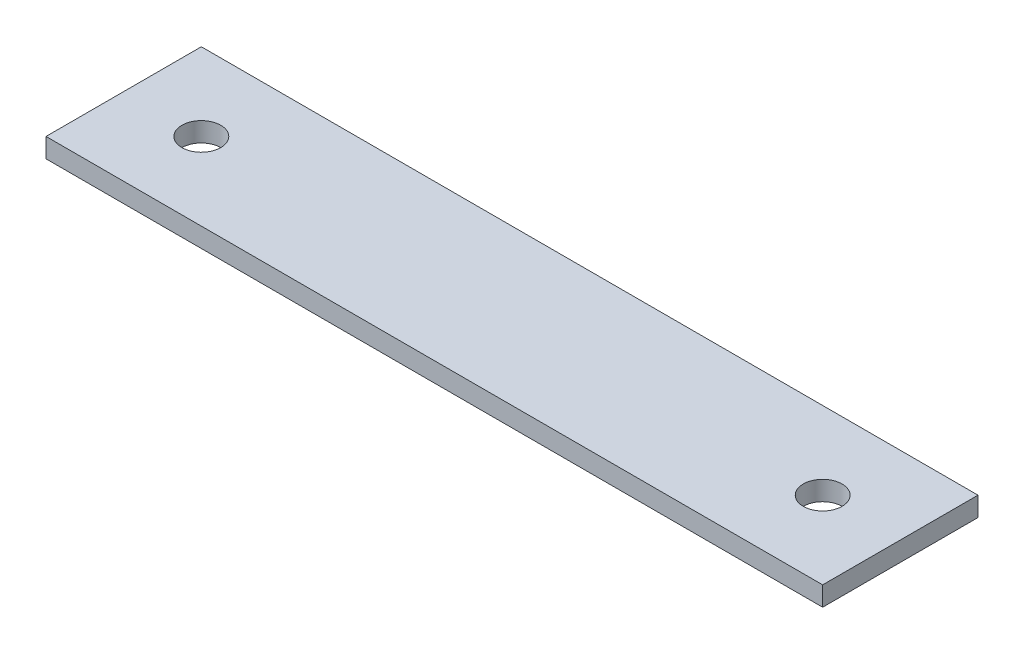
ISO-10303-21;
HEADER;
FILE_DESCRIPTION(('STEP AP214'),'2;1');
FILE_NAME('part.step','',(''),(''),'','','');
FILE_SCHEMA(('AUTOMOTIVE_DESIGN { 1 0 10303 214 1 1 1 1 }'));
ENDSEC;
DATA;
#1=APPLICATION_CONTEXT('core data for automotive mechanical design processes');
#2=APPLICATION_PROTOCOL_DEFINITION('international standard','automotive_design',2000,#1);
#3=PRODUCT_CONTEXT('',#1,'mechanical');
#4=PRODUCT('Part','Part','',(#3));
#5=PRODUCT_RELATED_PRODUCT_CATEGORY('part','',(#4));
#6=PRODUCT_DEFINITION_FORMATION('','',#4);
#7=PRODUCT_DEFINITION_CONTEXT('part definition',#1,'design');
#8=PRODUCT_DEFINITION('design','',#6,#7);
#9=PRODUCT_DEFINITION_SHAPE('','',#8);
#10=(LENGTH_UNIT() NAMED_UNIT(*) SI_UNIT(.MILLI.,.METRE.));
#11=(NAMED_UNIT(*) PLANE_ANGLE_UNIT() SI_UNIT($,.RADIAN.));
#12=(NAMED_UNIT(*) SI_UNIT($,.STERADIAN.) SOLID_ANGLE_UNIT());
#13=UNCERTAINTY_MEASURE_WITH_UNIT(LENGTH_MEASURE(1.E-05),#10,'distance_accuracy_value','');
#14=(GEOMETRIC_REPRESENTATION_CONTEXT(3) GLOBAL_UNCERTAINTY_ASSIGNED_CONTEXT((#13)) GLOBAL_UNIT_ASSIGNED_CONTEXT((#10,
#11,#12)) REPRESENTATION_CONTEXT('',''));
#15=CARTESIAN_POINT('',(0.,0.,0.));
#16=DIRECTION('',(0.,0.,1.));
#17=DIRECTION('',(1.,0.,0.));
#18=AXIS2_PLACEMENT_3D('',#15,#16,#17);
#19=CARTESIAN_POINT('',(0.,3.175,0.));
#20=DIRECTION('',(-1.,0.,0.));
#21=DIRECTION('',(0.,0.,1.));
#22=AXIS2_PLACEMENT_3D('',#19,#20,#21);
#23=PLANE('',#22);
#24=DIRECTION('',(0.,0.,-1.));
#25=VECTOR('',#24,1.);
#26=CARTESIAN_POINT('',(0.,0.,0.));
#27=LINE('',#26,#25);
#28=CARTESIAN_POINT('',(0.,0.,0.));
#29=VERTEX_POINT('',#28);
#30=CARTESIAN_POINT('',(0.,0.,-25.4));
#31=VERTEX_POINT('',#30);
#32=EDGE_CURVE('E102',#29,#31,#27,.T.);
#33=ORIENTED_EDGE('',*,*,#32,.F.);
#34=DIRECTION('',(0.,-1.,0.));
#35=VECTOR('',#34,1.);
#36=CARTESIAN_POINT('',(0.,3.175,0.));
#37=LINE('',#36,#35);
#38=CARTESIAN_POINT('',(0.,3.175,0.));
#39=VERTEX_POINT('',#38);
#40=EDGE_CURVE('E11',#39,#29,#37,.T.);
#41=ORIENTED_EDGE('',*,*,#40,.F.);
#42=DIRECTION('',(0.,0.,-1.));
#43=VECTOR('',#42,1.);
#44=CARTESIAN_POINT('',(0.,3.175,0.));
#45=LINE('',#44,#43);
#46=CARTESIAN_POINT('',(0.,3.175,-25.4));
#47=VERTEX_POINT('',#46);
#48=EDGE_CURVE('E96',#39,#47,#45,.T.);
#49=ORIENTED_EDGE('',*,*,#48,.T.);
#50=DIRECTION('',(0.,-1.,0.));
#51=VECTOR('',#50,1.);
#52=CARTESIAN_POINT('',(0.,3.175,-25.4));
#53=LINE('',#52,#51);
#54=EDGE_CURVE('E37',#47,#31,#53,.T.);
#55=ORIENTED_EDGE('',*,*,#54,.T.);
#56=EDGE_LOOP('',(#33,#41,#49,#55));
#57=FACE_BOUND('',#56,.T.);
#58=ADVANCED_FACE('F34',(#57),#23,.T.);
#59=CARTESIAN_POINT('',(0.,3.175,0.));
#60=DIRECTION('',(0.,0.,-1.));
#61=DIRECTION('',(-1.,0.,0.));
#62=AXIS2_PLACEMENT_3D('',#59,#60,#61);
#63=PLANE('',#62);
#64=DIRECTION('',(1.,0.,0.));
#65=VECTOR('',#64,1.);
#66=CARTESIAN_POINT('',(0.,0.,0.));
#67=LINE('',#66,#65);
#68=CARTESIAN_POINT('',(127.,0.,0.));
#69=VERTEX_POINT('',#68);
#70=EDGE_CURVE('E67',#29,#69,#67,.T.);
#71=ORIENTED_EDGE('',*,*,#70,.T.);
#72=DIRECTION('',(0.,-1.,0.));
#73=VECTOR('',#72,1.);
#74=CARTESIAN_POINT('',(127.,3.175,0.));
#75=LINE('',#74,#73);
#76=CARTESIAN_POINT('',(127.,3.175,0.));
#77=VERTEX_POINT('',#76);
#78=EDGE_CURVE('E43',#77,#69,#75,.T.);
#79=ORIENTED_EDGE('',*,*,#78,.F.);
#80=DIRECTION('',(1.,0.,0.));
#81=VECTOR('',#80,1.);
#82=CARTESIAN_POINT('',(0.,3.175,0.));
#83=LINE('',#82,#81);
#84=EDGE_CURVE('E84',#39,#77,#83,.T.);
#85=ORIENTED_EDGE('',*,*,#84,.F.);
#86=ORIENTED_EDGE('',*,*,#40,.T.);
#87=EDGE_LOOP('',(#71,#79,#85,#86));
#88=FACE_BOUND('',#87,.T.);
#89=ADVANCED_FACE('F114',(#88),#63,.F.);
#90=CARTESIAN_POINT('',(127.,3.175,0.));
#91=DIRECTION('',(-1.,0.,0.));
#92=DIRECTION('',(0.,0.,1.));
#93=AXIS2_PLACEMENT_3D('',#90,#91,#92);
#94=PLANE('',#93);
#95=DIRECTION('',(0.,0.,-1.));
#96=VECTOR('',#95,1.);
#97=CARTESIAN_POINT('',(127.,0.,0.));
#98=LINE('',#97,#96);
#99=CARTESIAN_POINT('',(127.,0.,-25.4));
#100=VERTEX_POINT('',#99);
#101=EDGE_CURVE('E92',#69,#100,#98,.T.);
#102=ORIENTED_EDGE('',*,*,#101,.T.);
#103=DIRECTION('',(0.,-1.,0.));
#104=VECTOR('',#103,1.);
#105=CARTESIAN_POINT('',(127.,3.175,-25.4));
#106=LINE('',#105,#104);
#107=CARTESIAN_POINT('',(127.,3.175,-25.4));
#108=VERTEX_POINT('',#107);
#109=EDGE_CURVE('E89',#108,#100,#106,.T.);
#110=ORIENTED_EDGE('',*,*,#109,.F.);
#111=DIRECTION('',(0.,0.,-1.));
#112=VECTOR('',#111,1.);
#113=CARTESIAN_POINT('',(127.,3.175,0.));
#114=LINE('',#113,#112);
#115=EDGE_CURVE('E79',#77,#108,#114,.T.);
#116=ORIENTED_EDGE('',*,*,#115,.F.);
#117=ORIENTED_EDGE('',*,*,#78,.T.);
#118=EDGE_LOOP('',(#102,#110,#116,#117));
#119=FACE_BOUND('',#118,.T.);
#120=ADVANCED_FACE('F90',(#119),#94,.F.);
#121=CARTESIAN_POINT('',(0.,3.175,-25.4));
#122=DIRECTION('',(0.,0.,-1.));
#123=DIRECTION('',(-1.,0.,0.));
#124=AXIS2_PLACEMENT_3D('',#121,#122,#123);
#125=PLANE('',#124);
#126=DIRECTION('',(1.,0.,0.));
#127=VECTOR('',#126,1.);
#128=CARTESIAN_POINT('',(0.,0.,-25.4));
#129=LINE('',#128,#127);
#130=EDGE_CURVE('E105',#31,#100,#129,.T.);
#131=ORIENTED_EDGE('',*,*,#130,.F.);
#132=ORIENTED_EDGE('',*,*,#54,.F.);
#133=DIRECTION('',(1.,0.,0.));
#134=VECTOR('',#133,1.);
#135=CARTESIAN_POINT('',(0.,3.175,-25.4));
#136=LINE('',#135,#134);
#137=EDGE_CURVE('E83',#47,#108,#136,.T.);
#138=ORIENTED_EDGE('',*,*,#137,.T.);
#139=ORIENTED_EDGE('',*,*,#109,.T.);
#140=EDGE_LOOP('',(#131,#132,#138,#139));
#141=FACE_BOUND('',#140,.T.);
#142=ADVANCED_FACE('F95',(#141),#125,.T.);
#143=CARTESIAN_POINT('',(0.,3.175,0.));
#144=DIRECTION('',(0.,-1.,0.));
#145=DIRECTION('',(0.,0.,-1.));
#146=AXIS2_PLACEMENT_3D('',#143,#144,#145);
#147=PLANE('',#146);
#148=CARTESIAN_POINT('',(114.3,3.175,-12.7));
#149=DIRECTION('',(0.,1.,0.));
#150=DIRECTION('',(0.,0.,1.));
#151=AXIS2_PLACEMENT_3D('',#148,#149,#150);
#152=CIRCLE('',#151,3.175);
#153=CARTESIAN_POINT('',(114.3,3.175,-9.525));
#154=VERTEX_POINT('',#153);
#155=EDGE_CURVE('E151',#154,#154,#152,.T.);
#156=ORIENTED_EDGE('',*,*,#155,.F.);
#157=EDGE_LOOP('',(#156));
#158=FACE_BOUND('',#157,.T.);
#159=CARTESIAN_POINT('',(12.7,3.175,-12.7));
#160=DIRECTION('',(0.,1.,0.));
#161=DIRECTION('',(0.,0.,1.));
#162=AXIS2_PLACEMENT_3D('',#159,#160,#161);
#163=CIRCLE('',#162,3.175);
#164=CARTESIAN_POINT('',(12.7,3.175,-9.525));
#165=VERTEX_POINT('',#164);
#166=EDGE_CURVE('E153',#165,#165,#163,.T.);
#167=ORIENTED_EDGE('',*,*,#166,.F.);
#168=EDGE_LOOP('',(#167));
#169=FACE_BOUND('',#168,.T.);
#170=ORIENTED_EDGE('',*,*,#48,.F.);
#171=ORIENTED_EDGE('',*,*,#84,.T.);
#172=ORIENTED_EDGE('',*,*,#115,.T.);
#173=ORIENTED_EDGE('',*,*,#137,.F.);
#174=EDGE_LOOP('',(#170,#171,#172,#173));
#175=FACE_BOUND('',#174,.T.);
#176=ADVANCED_FACE('F82',(#158,#169,#175),#147,.F.);
#177=CARTESIAN_POINT('',(0.,0.,0.));
#178=DIRECTION('',(0.,-1.,0.));
#179=DIRECTION('',(0.,0.,-1.));
#180=AXIS2_PLACEMENT_3D('',#177,#178,#179);
#181=PLANE('',#180);
#182=CARTESIAN_POINT('',(114.3,0.,-12.7));
#183=DIRECTION('',(0.,1.,0.));
#184=DIRECTION('',(0.,0.,1.));
#185=AXIS2_PLACEMENT_3D('',#182,#183,#184);
#186=CIRCLE('',#185,3.175);
#187=CARTESIAN_POINT('',(114.3,0.,-9.525));
#188=VERTEX_POINT('',#187);
#189=EDGE_CURVE('E149',#188,#188,#186,.T.);
#190=ORIENTED_EDGE('',*,*,#189,.T.);
#191=EDGE_LOOP('',(#190));
#192=FACE_BOUND('',#191,.T.);
#193=CARTESIAN_POINT('',(12.7,0.,-12.7));
#194=DIRECTION('',(0.,1.,0.));
#195=DIRECTION('',(0.,0.,1.));
#196=AXIS2_PLACEMENT_3D('',#193,#194,#195);
#197=CIRCLE('',#196,3.175);
#198=CARTESIAN_POINT('',(12.7,0.,-9.525));
#199=VERTEX_POINT('',#198);
#200=EDGE_CURVE('E106',#199,#199,#197,.T.);
#201=ORIENTED_EDGE('',*,*,#200,.T.);
#202=EDGE_LOOP('',(#201));
#203=FACE_BOUND('',#202,.T.);
#204=ORIENTED_EDGE('',*,*,#32,.T.);
#205=ORIENTED_EDGE('',*,*,#130,.T.);
#206=ORIENTED_EDGE('',*,*,#101,.F.);
#207=ORIENTED_EDGE('',*,*,#70,.F.);
#208=EDGE_LOOP('',(#204,#205,#206,#207));
#209=FACE_BOUND('',#208,.T.);
#210=ADVANCED_FACE('F112',(#192,#203,#209),#181,.T.);
#211=CARTESIAN_POINT('',(12.7,0.,-12.7));
#212=DIRECTION('',(0.,1.,0.));
#213=DIRECTION('',(0.,0.,1.));
#214=AXIS2_PLACEMENT_3D('',#211,#212,#213);
#215=CYLINDRICAL_SURFACE('',#214,3.175);
#216=ORIENTED_EDGE('',*,*,#200,.F.);
#217=EDGE_LOOP('',(#216));
#218=FACE_BOUND('',#217,.T.);
#219=ORIENTED_EDGE('',*,*,#166,.T.);
#220=EDGE_LOOP('',(#219));
#221=FACE_BOUND('',#220,.T.);
#222=ADVANCED_FACE('F133',(#218,#221),#215,.F.);
#223=CARTESIAN_POINT('',(114.3,0.,-12.7));
#224=DIRECTION('',(0.,1.,0.));
#225=DIRECTION('',(0.,0.,1.));
#226=AXIS2_PLACEMENT_3D('',#223,#224,#225);
#227=CYLINDRICAL_SURFACE('',#226,3.175);
#228=ORIENTED_EDGE('',*,*,#189,.F.);
#229=EDGE_LOOP('',(#228));
#230=FACE_BOUND('',#229,.T.);
#231=ORIENTED_EDGE('',*,*,#155,.T.);
#232=EDGE_LOOP('',(#231));
#233=FACE_BOUND('',#232,.T.);
#234=ADVANCED_FACE('F140',(#230,#233),#227,.F.);
#235=CLOSED_SHELL('',(#58,#89,#120,#142,#176,#210,#222,#234));
#236=MANIFOLD_SOLID_BREP('B2',#235);
#237=ADVANCED_BREP_SHAPE_REPRESENTATION('',(#18,#236),#14);
#238=SHAPE_DEFINITION_REPRESENTATION(#9,#237);
ENDSEC;
END-ISO-10303-21;
